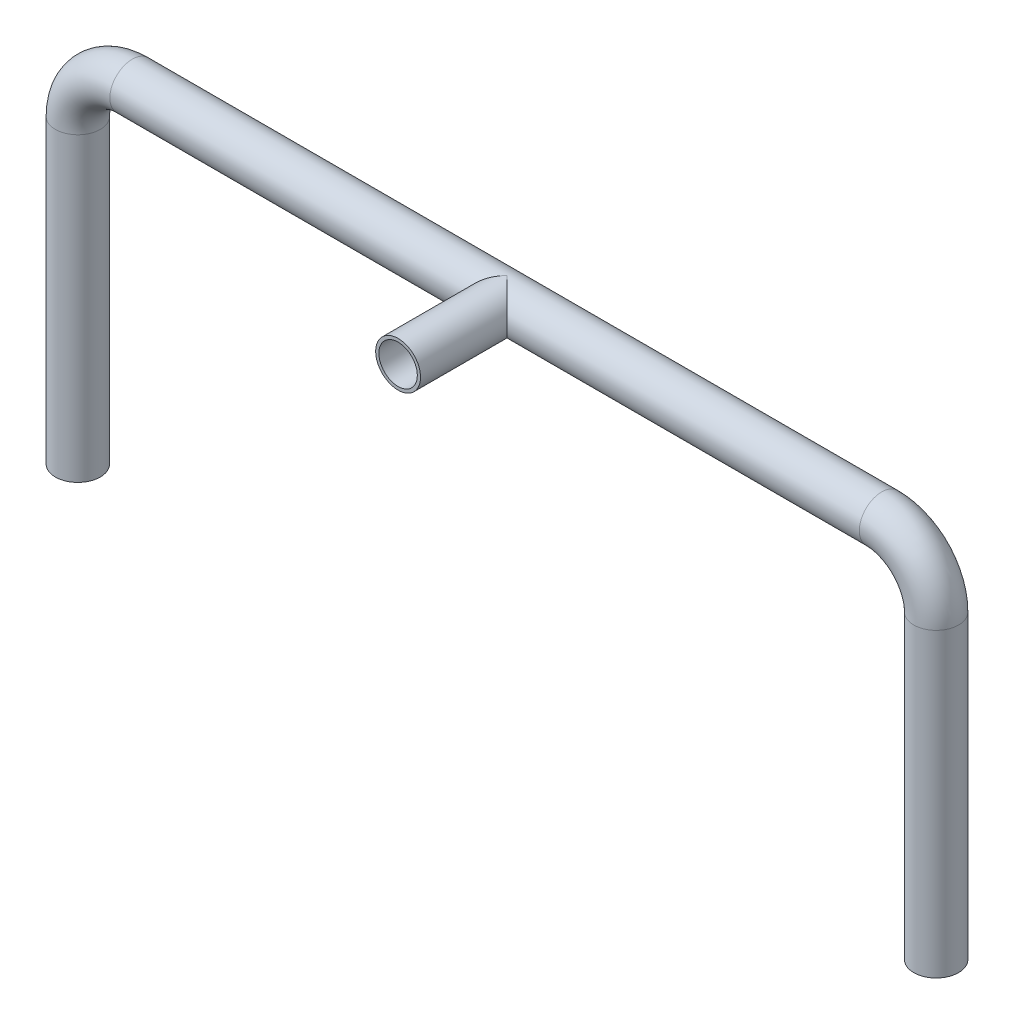
ISO-10303-21;
HEADER;
FILE_DESCRIPTION(('STEP AP214'),'2;1');
FILE_NAME('part.step','',(''),(''),'','','');
FILE_SCHEMA(('AUTOMOTIVE_DESIGN { 1 0 10303 214 1 1 1 1 }'));
ENDSEC;
DATA;
#1=APPLICATION_CONTEXT('core data for automotive mechanical design processes');
#2=APPLICATION_PROTOCOL_DEFINITION('international standard','automotive_design',2000,#1);
#3=PRODUCT_CONTEXT('',#1,'mechanical');
#4=PRODUCT('Part','Part','',(#3));
#5=PRODUCT_RELATED_PRODUCT_CATEGORY('part','',(#4));
#6=PRODUCT_DEFINITION_FORMATION('','',#4);
#7=PRODUCT_DEFINITION_CONTEXT('part definition',#1,'design');
#8=PRODUCT_DEFINITION('design','',#6,#7);
#9=PRODUCT_DEFINITION_SHAPE('','',#8);
#10=(LENGTH_UNIT() NAMED_UNIT(*) SI_UNIT(.MILLI.,.METRE.));
#11=(NAMED_UNIT(*) PLANE_ANGLE_UNIT() SI_UNIT($,.RADIAN.));
#12=(NAMED_UNIT(*) SI_UNIT($,.STERADIAN.) SOLID_ANGLE_UNIT());
#13=UNCERTAINTY_MEASURE_WITH_UNIT(LENGTH_MEASURE(1.E-05),#10,'distance_accuracy_value','');
#14=(GEOMETRIC_REPRESENTATION_CONTEXT(3) GLOBAL_UNCERTAINTY_ASSIGNED_CONTEXT((#13)) GLOBAL_UNIT_ASSIGNED_CONTEXT((#10,
#11,#12)) REPRESENTATION_CONTEXT('',''));
#15=CARTESIAN_POINT('',(0.,0.,0.));
#16=DIRECTION('',(0.,0.,1.));
#17=DIRECTION('',(1.,0.,0.));
#18=AXIS2_PLACEMENT_3D('',#15,#16,#17);
#19=CARTESIAN_POINT('',(0.,0.,0.));
#20=DIRECTION('',(0.,-1.,0.));
#21=DIRECTION('',(0.,0.,1.));
#22=AXIS2_PLACEMENT_3D('',#19,#20,#21);
#23=PLANE('',#22);
#24=CARTESIAN_POINT('',(0.,0.,0.));
#25=DIRECTION('',(0.,-1.,0.));
#26=DIRECTION('',(0.,0.,-1.));
#27=AXIS2_PLACEMENT_3D('',#24,#25,#26);
#28=CIRCLE('',#27,3.);
#29=CARTESIAN_POINT('',(0.,0.,-3.));
#30=VERTEX_POINT('',#29);
#31=EDGE_CURVE('E109',#30,#30,#28,.T.);
#32=ORIENTED_EDGE('',*,*,#31,.F.);
#33=EDGE_LOOP('',(#32));
#34=FACE_BOUND('',#33,.T.);
#35=CARTESIAN_POINT('',(0.,0.,0.));
#36=DIRECTION('',(0.,-1.,0.));
#37=DIRECTION('',(0.,0.,1.));
#38=AXIS2_PLACEMENT_3D('',#35,#36,#37);
#39=CIRCLE('',#38,3.5);
#40=CARTESIAN_POINT('',(0.,0.,3.5));
#41=VERTEX_POINT('',#40);
#42=EDGE_CURVE('E113',#41,#41,#39,.T.);
#43=ORIENTED_EDGE('',*,*,#42,.T.);
#44=EDGE_LOOP('',(#43));
#45=FACE_BOUND('',#44,.T.);
#46=ADVANCED_FACE('F57',(#34,#45),#23,.T.);
#47=CARTESIAN_POINT('',(134.,0.,0.));
#48=DIRECTION('',(0.,1.,0.));
#49=DIRECTION('',(0.,0.,1.));
#50=AXIS2_PLACEMENT_3D('',#47,#48,#49);
#51=PLANE('',#50);
#52=CARTESIAN_POINT('',(134.,0.,0.));
#53=DIRECTION('',(0.,-1.,0.));
#54=DIRECTION('',(0.,0.,-1.));
#55=AXIS2_PLACEMENT_3D('',#52,#53,#54);
#56=CIRCLE('',#55,2.99999999999999);
#57=CARTESIAN_POINT('',(134.,0.,-2.99999999999998));
#58=VERTEX_POINT('',#57);
#59=EDGE_CURVE('E106',#58,#58,#56,.T.);
#60=ORIENTED_EDGE('',*,*,#59,.F.);
#61=EDGE_LOOP('',(#60));
#62=FACE_BOUND('',#61,.T.);
#63=CARTESIAN_POINT('',(134.,0.,0.));
#64=DIRECTION('',(0.,1.,0.));
#65=DIRECTION('',(0.,0.,1.));
#66=AXIS2_PLACEMENT_3D('',#63,#64,#65);
#67=CIRCLE('',#66,3.5);
#68=CARTESIAN_POINT('',(134.,0.,3.5));
#69=VERTEX_POINT('',#68);
#70=EDGE_CURVE('E12',#69,#69,#67,.T.);
#71=ORIENTED_EDGE('',*,*,#70,.F.);
#72=EDGE_LOOP('',(#71));
#73=FACE_BOUND('',#72,.T.);
#74=ADVANCED_FACE('F157',(#62,#73),#51,.F.);
#75=CARTESIAN_POINT('',(0.,0.,0.));
#76=DIRECTION('',(0.,1.,0.));
#77=DIRECTION('',(0.,0.,1.));
#78=AXIS2_PLACEMENT_3D('',#75,#76,#77);
#79=CYLINDRICAL_SURFACE('',#78,3.5);
#80=CARTESIAN_POINT('',(0.,47.,0.));
#81=DIRECTION('',(0.,-1.,0.));
#82=DIRECTION('',(0.,0.,1.));
#83=AXIS2_PLACEMENT_3D('',#80,#81,#82);
#84=CIRCLE('',#83,3.5);
#85=CARTESIAN_POINT('',(-3.5,47.,0.));
#86=VERTEX_POINT('',#85);
#87=EDGE_CURVE('E127',#86,#86,#84,.T.);
#88=ORIENTED_EDGE('',*,*,#87,.T.);
#89=EDGE_LOOP('',(#88));
#90=FACE_BOUND('',#89,.T.);
#91=ORIENTED_EDGE('',*,*,#42,.F.);
#92=EDGE_LOOP('',(#91));
#93=FACE_BOUND('',#92,.T.);
#94=ADVANCED_FACE('F159',(#90,#93),#79,.T.);
#95=CARTESIAN_POINT('',(8.5,47.,0.));
#96=DIRECTION('',(0.,0.,-1.));
#97=DIRECTION('',(-1.,0.,0.));
#98=AXIS2_PLACEMENT_3D('',#95,#96,#97);
#99=TOROIDAL_SURFACE('',#98,8.5,3.5);
#100=CARTESIAN_POINT('',(8.5,55.5,0.));
#101=DIRECTION('',(-1.,0.,0.));
#102=DIRECTION('',(0.,0.,1.));
#103=AXIS2_PLACEMENT_3D('',#100,#101,#102);
#104=CIRCLE('',#103,3.5);
#105=CARTESIAN_POINT('',(8.5,59.,0.));
#106=VERTEX_POINT('',#105);
#107=EDGE_CURVE('E130',#106,#106,#104,.T.);
#108=CARTESIAN_POINT('',(8.5,47.,0.));
#109=DIRECTION('',(0.,0.,-1.));
#110=DIRECTION('',(-1.,0.,0.));
#111=AXIS2_PLACEMENT_3D('',#108,#109,#110);
#112=CIRCLE('',#111,12.);
#113=EDGE_CURVE('',#86,#106,#112,.T.);
#114=ORIENTED_EDGE('',*,*,#87,.F.);
#115=ORIENTED_EDGE('',*,*,#107,.T.);
#116=ORIENTED_EDGE('',*,*,#113,.T.);
#117=ORIENTED_EDGE('',*,*,#113,.F.);
#118=EDGE_LOOP('',(#114,#116,#115,#117));
#119=FACE_BOUND('',#118,.T.);
#120=ADVANCED_FACE('F165',(#119),#99,.T.);
#121=CARTESIAN_POINT('',(8.5,55.5,0.));
#122=DIRECTION('',(1.,0.,0.));
#123=DIRECTION('',(0.,0.,-1.));
#124=AXIS2_PLACEMENT_3D('',#121,#122,#123);
#125=CYLINDRICAL_SURFACE('',#124,3.5);
#126=CARTESIAN_POINT('',(67.,55.5,0.));
#127=DIRECTION('',(0.707106781186548,0.,-0.707106781186547));
#128=DIRECTION('',(0.707106781186547,0.,0.707106781186547));
#129=AXIS2_PLACEMENT_3D('',#126,#127,#128);
#130=ELLIPSE('',#129,4.94974746830584,3.5);
#131=CARTESIAN_POINT('',(67.,59.,0.));
#132=VERTEX_POINT('',#131);
#133=CARTESIAN_POINT('',(67.,52.,0.));
#134=VERTEX_POINT('',#133);
#135=EDGE_CURVE('E100',#132,#134,#130,.T.);
#136=ORIENTED_EDGE('',*,*,#135,.T.);
#137=CARTESIAN_POINT('',(67.,55.5,0.));
#138=DIRECTION('',(0.707106781186547,0.,0.707106781186547));
#139=DIRECTION('',(0.707106781186548,0.,-0.707106781186547));
#140=AXIS2_PLACEMENT_3D('',#137,#138,#139);
#141=ELLIPSE('',#140,4.94974746830584,3.5);
#142=EDGE_CURVE('E77',#134,#132,#141,.F.);
#143=ORIENTED_EDGE('',*,*,#142,.T.);
#144=EDGE_LOOP('',(#136,#143));
#145=FACE_BOUND('',#144,.T.);
#146=CARTESIAN_POINT('',(125.5,55.5,0.));
#147=DIRECTION('',(-1.,0.,0.));
#148=DIRECTION('',(0.,0.,1.));
#149=AXIS2_PLACEMENT_3D('',#146,#147,#148);
#150=CIRCLE('',#149,3.5);
#151=CARTESIAN_POINT('',(125.5,59.,0.));
#152=VERTEX_POINT('',#151);
#153=EDGE_CURVE('E133',#152,#152,#150,.T.);
#154=ORIENTED_EDGE('',*,*,#153,.T.);
#155=EDGE_LOOP('',(#154));
#156=FACE_BOUND('',#155,.T.);
#157=ORIENTED_EDGE('',*,*,#107,.F.);
#158=EDGE_LOOP('',(#157));
#159=FACE_BOUND('',#158,.T.);
#160=ADVANCED_FACE('F154',(#145,#156,#159),#125,.T.);
#161=CARTESIAN_POINT('',(125.5,47.,0.));
#162=DIRECTION('',(0.,0.,-1.));
#163=DIRECTION('',(-1.,0.,0.));
#164=AXIS2_PLACEMENT_3D('',#161,#162,#163);
#165=TOROIDAL_SURFACE('',#164,8.50000000000001,3.5);
#166=CARTESIAN_POINT('',(134.,47.,0.));
#167=DIRECTION('',(0.,1.,0.));
#168=DIRECTION('',(0.,0.,1.));
#169=AXIS2_PLACEMENT_3D('',#166,#167,#168);
#170=CIRCLE('',#169,3.5);
#171=CARTESIAN_POINT('',(137.5,47.,0.));
#172=VERTEX_POINT('',#171);
#173=EDGE_CURVE('E64',#172,#172,#170,.T.);
#174=CARTESIAN_POINT('',(125.5,47.,0.));
#175=DIRECTION('',(0.,0.,-1.));
#176=DIRECTION('',(-1.,0.,0.));
#177=AXIS2_PLACEMENT_3D('',#174,#175,#176);
#178=CIRCLE('',#177,12.);
#179=EDGE_CURVE('',#152,#172,#178,.T.);
#180=ORIENTED_EDGE('',*,*,#153,.F.);
#181=ORIENTED_EDGE('',*,*,#173,.T.);
#182=ORIENTED_EDGE('',*,*,#179,.T.);
#183=ORIENTED_EDGE('',*,*,#179,.F.);
#184=EDGE_LOOP('',(#180,#182,#181,#183));
#185=FACE_BOUND('',#184,.T.);
#186=ADVANCED_FACE('F138',(#185),#165,.T.);
#187=CARTESIAN_POINT('',(134.,47.,0.));
#188=DIRECTION('',(0.,-1.,0.));
#189=DIRECTION('',(0.,0.,-1.));
#190=AXIS2_PLACEMENT_3D('',#187,#188,#189);
#191=CYLINDRICAL_SURFACE('',#190,3.5);
#192=ORIENTED_EDGE('',*,*,#70,.T.);
#193=EDGE_LOOP('',(#192));
#194=FACE_BOUND('',#193,.T.);
#195=ORIENTED_EDGE('',*,*,#173,.F.);
#196=EDGE_LOOP('',(#195));
#197=FACE_BOUND('',#196,.T.);
#198=ADVANCED_FACE('F141',(#194,#197),#191,.T.);
#199=CARTESIAN_POINT('',(0.,0.,0.));
#200=DIRECTION('',(0.,1.,0.));
#201=DIRECTION('',(0.,0.,1.));
#202=AXIS2_PLACEMENT_3D('',#199,#200,#201);
#203=CYLINDRICAL_SURFACE('',#202,3.);
#204=CARTESIAN_POINT('',(0.,47.,0.));
#205=DIRECTION('',(0.,1.,0.));
#206=DIRECTION('',(0.,0.,1.));
#207=AXIS2_PLACEMENT_3D('',#204,#205,#206);
#208=CIRCLE('',#207,3.);
#209=CARTESIAN_POINT('',(-3.,47.,0.));
#210=VERTEX_POINT('',#209);
#211=EDGE_CURVE('E120',#210,#210,#208,.F.);
#212=ORIENTED_EDGE('',*,*,#211,.F.);
#213=EDGE_LOOP('',(#212));
#214=FACE_BOUND('',#213,.T.);
#215=ORIENTED_EDGE('',*,*,#31,.T.);
#216=EDGE_LOOP('',(#215));
#217=FACE_BOUND('',#216,.T.);
#218=ADVANCED_FACE('F143',(#214,#217),#203,.F.);
#219=CARTESIAN_POINT('',(8.5,47.,0.));
#220=DIRECTION('',(0.,0.,-1.));
#221=DIRECTION('',(-1.,0.,0.));
#222=AXIS2_PLACEMENT_3D('',#219,#220,#221);
#223=TOROIDAL_SURFACE('',#222,8.5,3.);
#224=CARTESIAN_POINT('',(8.5,55.5,0.));
#225=DIRECTION('',(-1.,0.,0.));
#226=DIRECTION('',(0.,-1.,0.));
#227=AXIS2_PLACEMENT_3D('',#224,#225,#226);
#228=CIRCLE('',#227,3.);
#229=CARTESIAN_POINT('',(8.5,58.5,0.));
#230=VERTEX_POINT('',#229);
#231=EDGE_CURVE('E117',#230,#230,#228,.T.);
#232=CARTESIAN_POINT('',(8.5,47.,0.));
#233=DIRECTION('',(0.,0.,-1.));
#234=DIRECTION('',(-1.,0.,0.));
#235=AXIS2_PLACEMENT_3D('',#232,#233,#234);
#236=CIRCLE('',#235,11.5);
#237=EDGE_CURVE('',#210,#230,#236,.T.);
#238=ORIENTED_EDGE('',*,*,#211,.T.);
#239=ORIENTED_EDGE('',*,*,#231,.F.);
#240=ORIENTED_EDGE('',*,*,#237,.T.);
#241=ORIENTED_EDGE('',*,*,#237,.F.);
#242=EDGE_LOOP('',(#238,#240,#239,#241));
#243=FACE_BOUND('',#242,.T.);
#244=ADVANCED_FACE('F150',(#243),#223,.F.);
#245=CARTESIAN_POINT('',(8.5,55.5,0.));
#246=DIRECTION('',(1.,0.,0.));
#247=DIRECTION('',(0.,0.,-1.));
#248=AXIS2_PLACEMENT_3D('',#245,#246,#247);
#249=CYLINDRICAL_SURFACE('',#248,3.);
#250=CARTESIAN_POINT('',(67.,55.5,0.));
#251=DIRECTION('',(0.707106781186547,0.,0.707106781186547));
#252=DIRECTION('',(0.707106781186548,0.,-0.707106781186547));
#253=AXIS2_PLACEMENT_3D('',#250,#251,#252);
#254=ELLIPSE('',#253,4.24264068711929,3.00000000000001);
#255=CARTESIAN_POINT('',(67.,52.5,0.));
#256=VERTEX_POINT('',#255);
#257=CARTESIAN_POINT('',(67.,58.5,0.));
#258=VERTEX_POINT('',#257);
#259=EDGE_CURVE('E70',#256,#258,#254,.F.);
#260=ORIENTED_EDGE('',*,*,#259,.F.);
#261=CARTESIAN_POINT('',(67.,55.5,0.));
#262=DIRECTION('',(0.707106781186548,0.,-0.707106781186547));
#263=DIRECTION('',(0.707106781186547,0.,0.707106781186547));
#264=AXIS2_PLACEMENT_3D('',#261,#262,#263);
#265=ELLIPSE('',#264,4.24264068711929,3.00000000000001);
#266=EDGE_CURVE('E90',#258,#256,#265,.T.);
#267=ORIENTED_EDGE('',*,*,#266,.F.);
#268=EDGE_LOOP('',(#260,#267));
#269=FACE_BOUND('',#268,.T.);
#270=CARTESIAN_POINT('',(125.5,55.5,0.));
#271=DIRECTION('',(1.,0.,0.));
#272=DIRECTION('',(0.,0.,-1.));
#273=AXIS2_PLACEMENT_3D('',#270,#271,#272);
#274=CIRCLE('',#273,3.);
#275=CARTESIAN_POINT('',(125.5,58.5,0.));
#276=VERTEX_POINT('',#275);
#277=EDGE_CURVE('E114',#276,#276,#274,.F.);
#278=ORIENTED_EDGE('',*,*,#277,.F.);
#279=EDGE_LOOP('',(#278));
#280=FACE_BOUND('',#279,.T.);
#281=ORIENTED_EDGE('',*,*,#231,.T.);
#282=EDGE_LOOP('',(#281));
#283=FACE_BOUND('',#282,.T.);
#284=ADVANCED_FACE('F96',(#269,#280,#283),#249,.F.);
#285=CARTESIAN_POINT('',(125.5,47.,0.));
#286=DIRECTION('',(0.,0.,-1.));
#287=DIRECTION('',(-1.,0.,0.));
#288=AXIS2_PLACEMENT_3D('',#285,#286,#287);
#289=TOROIDAL_SURFACE('',#288,8.50000000000001,3.);
#290=CARTESIAN_POINT('',(134.,47.,0.));
#291=DIRECTION('',(0.,1.,0.));
#292=DIRECTION('',(-1.,0.,0.));
#293=AXIS2_PLACEMENT_3D('',#290,#291,#292);
#294=CIRCLE('',#293,3.);
#295=CARTESIAN_POINT('',(137.,47.,0.));
#296=VERTEX_POINT('',#295);
#297=EDGE_CURVE('E110',#296,#296,#294,.T.);
#298=CARTESIAN_POINT('',(125.5,47.,0.));
#299=DIRECTION('',(0.,0.,-1.));
#300=DIRECTION('',(-1.,0.,0.));
#301=AXIS2_PLACEMENT_3D('',#298,#299,#300);
#302=CIRCLE('',#301,11.5);
#303=EDGE_CURVE('',#276,#296,#302,.T.);
#304=ORIENTED_EDGE('',*,*,#277,.T.);
#305=ORIENTED_EDGE('',*,*,#297,.F.);
#306=ORIENTED_EDGE('',*,*,#303,.T.);
#307=ORIENTED_EDGE('',*,*,#303,.F.);
#308=EDGE_LOOP('',(#304,#306,#305,#307));
#309=FACE_BOUND('',#308,.T.);
#310=ADVANCED_FACE('F175',(#309),#289,.F.);
#311=CARTESIAN_POINT('',(134.,47.,0.));
#312=DIRECTION('',(0.,-1.,0.));
#313=DIRECTION('',(0.,0.,-1.));
#314=AXIS2_PLACEMENT_3D('',#311,#312,#313);
#315=CYLINDRICAL_SURFACE('',#314,3.);
#316=ORIENTED_EDGE('',*,*,#297,.T.);
#317=EDGE_LOOP('',(#316));
#318=FACE_BOUND('',#317,.T.);
#319=ORIENTED_EDGE('',*,*,#59,.T.);
#320=EDGE_LOOP('',(#319));
#321=FACE_BOUND('',#320,.T.);
#322=ADVANCED_FACE('F169',(#318,#321),#315,.F.);
#323=CARTESIAN_POINT('',(67.,55.5,0.));
#324=DIRECTION('',(0.,0.,1.));
#325=DIRECTION('',(1.,0.,0.));
#326=AXIS2_PLACEMENT_3D('',#323,#324,#325);
#327=CYLINDRICAL_SURFACE('',#326,3.5);
#328=CARTESIAN_POINT('',(67.,55.5,17.));
#329=DIRECTION('',(0.,0.,1.));
#330=DIRECTION('',(1.,0.,0.));
#331=AXIS2_PLACEMENT_3D('',#328,#329,#330);
#332=CIRCLE('',#331,3.5);
#333=CARTESIAN_POINT('',(70.5,55.5,17.));
#334=VERTEX_POINT('',#333);
#335=EDGE_CURVE('E98',#334,#334,#332,.T.);
#336=ORIENTED_EDGE('',*,*,#335,.F.);
#337=EDGE_LOOP('',(#336));
#338=FACE_BOUND('',#337,.T.);
#339=ORIENTED_EDGE('',*,*,#142,.F.);
#340=ORIENTED_EDGE('',*,*,#135,.F.);
#341=EDGE_LOOP('',(#339,#340));
#342=FACE_BOUND('',#341,.T.);
#343=ADVANCED_FACE('F153',(#338,#342),#327,.T.);
#344=CARTESIAN_POINT('',(67.,55.5,17.));
#345=DIRECTION('',(0.,0.,1.));
#346=DIRECTION('',(1.,0.,0.));
#347=AXIS2_PLACEMENT_3D('',#344,#345,#346);
#348=PLANE('',#347);
#349=CARTESIAN_POINT('',(67.,55.5,17.));
#350=DIRECTION('',(0.,0.,1.));
#351=DIRECTION('',(1.,0.,0.));
#352=AXIS2_PLACEMENT_3D('',#349,#350,#351);
#353=CIRCLE('',#352,3.00000000000001);
#354=CARTESIAN_POINT('',(70.,55.5,17.));
#355=VERTEX_POINT('',#354);
#356=EDGE_CURVE('E94',#355,#355,#353,.T.);
#357=ORIENTED_EDGE('',*,*,#356,.F.);
#358=EDGE_LOOP('',(#357));
#359=FACE_BOUND('',#358,.T.);
#360=ORIENTED_EDGE('',*,*,#335,.T.);
#361=EDGE_LOOP('',(#360));
#362=FACE_BOUND('',#361,.T.);
#363=ADVANCED_FACE('F182',(#359,#362),#348,.T.);
#364=CARTESIAN_POINT('',(67.,55.5,0.));
#365=DIRECTION('',(0.,0.,1.));
#366=DIRECTION('',(1.,0.,0.));
#367=AXIS2_PLACEMENT_3D('',#364,#365,#366);
#368=CYLINDRICAL_SURFACE('',#367,3.00000000000001);
#369=ORIENTED_EDGE('',*,*,#259,.T.);
#370=ORIENTED_EDGE('',*,*,#266,.T.);
#371=EDGE_LOOP('',(#369,#370));
#372=FACE_BOUND('',#371,.T.);
#373=ORIENTED_EDGE('',*,*,#356,.T.);
#374=EDGE_LOOP('',(#373));
#375=FACE_BOUND('',#374,.T.);
#376=ADVANCED_FACE('F91',(#372,#375),#368,.F.);
#377=CLOSED_SHELL('',(#46,#74,#94,#120,#160,#186,#198,#218,#244,#284,#310,#322,#343,#363,#376));
#378=MANIFOLD_SOLID_BREP('B2',#377);
#379=ADVANCED_BREP_SHAPE_REPRESENTATION('',(#18,#378),#14);
#380=SHAPE_DEFINITION_REPRESENTATION(#9,#379);
ENDSEC;
END-ISO-10303-21;
